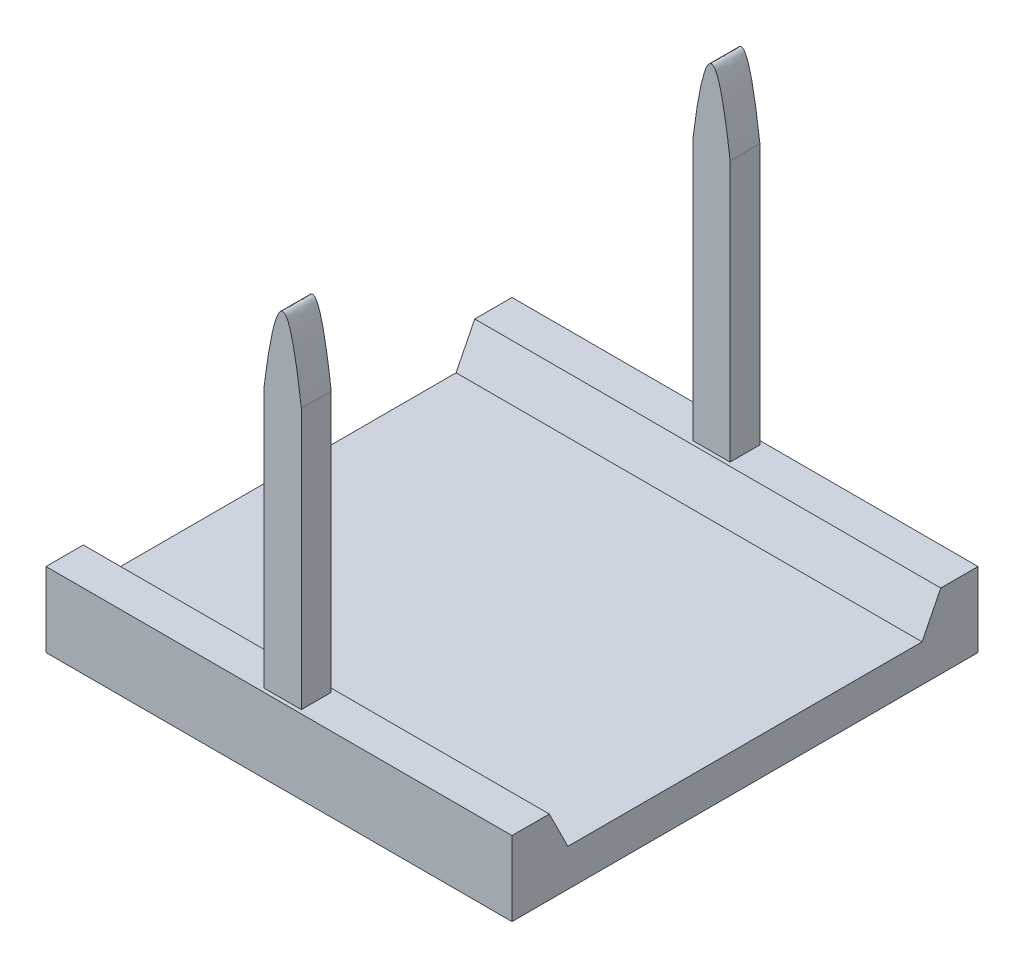
ISO-10303-21;
HEADER;
FILE_DESCRIPTION(('STEP AP214'),'2;1');
FILE_NAME('part.step','',(''),(''),'','','');
FILE_SCHEMA(('AUTOMOTIVE_DESIGN { 1 0 10303 214 1 1 1 1 }'));
ENDSEC;
DATA;
#1=APPLICATION_CONTEXT('core data for automotive mechanical design processes');
#2=APPLICATION_PROTOCOL_DEFINITION('international standard','automotive_design',2000,#1);
#3=PRODUCT_CONTEXT('',#1,'mechanical');
#4=PRODUCT('Part','Part','',(#3));
#5=PRODUCT_RELATED_PRODUCT_CATEGORY('part','',(#4));
#6=PRODUCT_DEFINITION_FORMATION('','',#4);
#7=PRODUCT_DEFINITION_CONTEXT('part definition',#1,'design');
#8=PRODUCT_DEFINITION('design','',#6,#7);
#9=PRODUCT_DEFINITION_SHAPE('','',#8);
#10=(LENGTH_UNIT() NAMED_UNIT(*) SI_UNIT(.MILLI.,.METRE.));
#11=(NAMED_UNIT(*) PLANE_ANGLE_UNIT() SI_UNIT($,.RADIAN.));
#12=(NAMED_UNIT(*) SI_UNIT($,.STERADIAN.) SOLID_ANGLE_UNIT());
#13=UNCERTAINTY_MEASURE_WITH_UNIT(LENGTH_MEASURE(1.E-05),#10,'distance_accuracy_value','');
#14=(GEOMETRIC_REPRESENTATION_CONTEXT(3) GLOBAL_UNCERTAINTY_ASSIGNED_CONTEXT((#13)) GLOBAL_UNIT_ASSIGNED_CONTEXT((#10,
#11,#12)) REPRESENTATION_CONTEXT('',''));
#15=CARTESIAN_POINT('',(0.,0.,0.));
#16=DIRECTION('',(0.,0.,1.));
#17=DIRECTION('',(1.,0.,0.));
#18=AXIS2_PLACEMENT_3D('',#15,#16,#17);
#19=CARTESIAN_POINT('',(0.,20.,-125.));
#20=DIRECTION('',(0.,0.,1.));
#21=DIRECTION('',(1.,0.,0.));
#22=AXIS2_PLACEMENT_3D('',#19,#20,#21);
#23=PLANE('',#22);
#24=DIRECTION('',(0.,-1.,0.));
#25=VECTOR('',#24,1.);
#26=CARTESIAN_POINT('',(0.,20.,-125.));
#27=LINE('',#26,#25);
#28=CARTESIAN_POINT('',(0.,20.,-125.));
#29=VERTEX_POINT('',#28);
#30=CARTESIAN_POINT('',(0.,0.,-125.));
#31=VERTEX_POINT('',#30);
#32=EDGE_CURVE('E307',#29,#31,#27,.T.);
#33=ORIENTED_EDGE('',*,*,#32,.F.);
#34=DIRECTION('',(-1.,0.,0.));
#35=VECTOR('',#34,1.);
#36=CARTESIAN_POINT('',(0.,20.,-125.));
#37=LINE('',#36,#35);
#38=CARTESIAN_POINT('',(125.,20.,-125.));
#39=VERTEX_POINT('',#38);
#40=EDGE_CURVE('E302',#39,#29,#37,.T.);
#41=ORIENTED_EDGE('',*,*,#40,.F.);
#42=DIRECTION('',(0.,-1.,0.));
#43=VECTOR('',#42,1.);
#44=CARTESIAN_POINT('',(125.,20.,-125.));
#45=LINE('',#44,#43);
#46=CARTESIAN_POINT('',(125.,0.,-125.));
#47=VERTEX_POINT('',#46);
#48=EDGE_CURVE('E295',#39,#47,#45,.T.);
#49=ORIENTED_EDGE('',*,*,#48,.T.);
#50=DIRECTION('',(-1.,0.,0.));
#51=VECTOR('',#50,1.);
#52=CARTESIAN_POINT('',(0.,0.,-125.));
#53=LINE('',#52,#51);
#54=EDGE_CURVE('E322',#47,#31,#53,.T.);
#55=ORIENTED_EDGE('',*,*,#54,.T.);
#56=EDGE_LOOP('',(#33,#41,#49,#55));
#57=FACE_BOUND('',#56,.T.);
#58=ADVANCED_FACE('F39',(#57),#23,.F.);
#59=CARTESIAN_POINT('',(0.,20.,0.));
#60=DIRECTION('',(0.,-1.,0.));
#61=DIRECTION('',(0.,0.,-1.));
#62=AXIS2_PLACEMENT_3D('',#59,#60,#61);
#63=PLANE('',#62);
#64=DIRECTION('',(0.,0.,-1.));
#65=VECTOR('',#64,1.);
#66=CARTESIAN_POINT('',(67.5,20.,-115.));
#67=LINE('',#66,#65);
#68=CARTESIAN_POINT('',(67.5000000000001,20.,-116.));
#69=VERTEX_POINT('',#68);
#70=CARTESIAN_POINT('',(67.5,20.,-124.));
#71=VERTEX_POINT('',#70);
#72=EDGE_CURVE('E181',#69,#71,#67,.T.);
#73=ORIENTED_EDGE('',*,*,#72,.F.);
#74=DIRECTION('',(-1.,0.,0.));
#75=VECTOR('',#74,1.);
#76=CARTESIAN_POINT('',(67.5000000000001,20.,-116.));
#77=LINE('',#76,#75);
#78=CARTESIAN_POINT('',(57.5,20.,-116.));
#79=VERTEX_POINT('',#78);
#80=EDGE_CURVE('E160',#69,#79,#77,.T.);
#81=ORIENTED_EDGE('',*,*,#80,.T.);
#82=DIRECTION('',(0.,0.,-1.));
#83=VECTOR('',#82,1.);
#84=CARTESIAN_POINT('',(57.5,20.,-115.));
#85=LINE('',#84,#83);
#86=CARTESIAN_POINT('',(57.5,20.,-124.));
#87=VERTEX_POINT('',#86);
#88=EDGE_CURVE('E55',#79,#87,#85,.T.);
#89=ORIENTED_EDGE('',*,*,#88,.T.);
#90=DIRECTION('',(1.,0.,0.));
#91=VECTOR('',#90,1.);
#92=CARTESIAN_POINT('',(57.5,20.,-124.));
#93=LINE('',#92,#91);
#94=EDGE_CURVE('E389',#87,#71,#93,.T.);
#95=ORIENTED_EDGE('',*,*,#94,.T.);
#96=EDGE_LOOP('',(#73,#81,#89,#95));
#97=FACE_BOUND('',#96,.T.);
#98=DIRECTION('',(0.,0.,1.));
#99=VECTOR('',#98,1.);
#100=CARTESIAN_POINT('',(0.,20.,0.));
#101=LINE('',#100,#99);
#102=CARTESIAN_POINT('',(0.,20.,-115.));
#103=VERTEX_POINT('',#102);
#104=EDGE_CURVE('E370',#29,#103,#101,.T.);
#105=ORIENTED_EDGE('',*,*,#104,.T.);
#106=DIRECTION('',(-1.,0.,0.));
#107=VECTOR('',#106,1.);
#108=CARTESIAN_POINT('',(503.630585933215,20.,-115.));
#109=LINE('',#108,#107);
#110=CARTESIAN_POINT('',(125.,20.,-115.));
#111=VERTEX_POINT('',#110);
#112=EDGE_CURVE('E350',#111,#103,#109,.T.);
#113=ORIENTED_EDGE('',*,*,#112,.F.);
#114=DIRECTION('',(0.,0.,-1.));
#115=VECTOR('',#114,1.);
#116=CARTESIAN_POINT('',(125.,20.,0.));
#117=LINE('',#116,#115);
#118=EDGE_CURVE('E303',#111,#39,#117,.T.);
#119=ORIENTED_EDGE('',*,*,#118,.T.);
#120=ORIENTED_EDGE('',*,*,#40,.T.);
#121=EDGE_LOOP('',(#105,#113,#119,#120));
#122=FACE_BOUND('',#121,.T.);
#123=ADVANCED_FACE('F269',(#97,#122),#63,.F.);
#124=CARTESIAN_POINT('',(0.,20.,0.));
#125=DIRECTION('',(1.,0.,0.));
#126=DIRECTION('',(0.,0.,-1.));
#127=AXIS2_PLACEMENT_3D('',#124,#125,#126);
#128=PLANE('',#127);
#129=DIRECTION('',(0.,0.894427190999916,0.447213595499958));
#130=VECTOR('',#129,1.);
#131=CARTESIAN_POINT('',(0.,24.,-8.));
#132=LINE('',#131,#130);
#133=CARTESIAN_POINT('',(0.,10.,-15.));
#134=VERTEX_POINT('',#133);
#135=CARTESIAN_POINT('',(0.,20.,-10.));
#136=VERTEX_POINT('',#135);
#137=EDGE_CURVE('E316',#134,#136,#132,.T.);
#138=ORIENTED_EDGE('',*,*,#137,.F.);
#139=DIRECTION('',(0.,0.,1.));
#140=VECTOR('',#139,1.);
#141=CARTESIAN_POINT('',(0.,10.,0.));
#142=LINE('',#141,#140);
#143=CARTESIAN_POINT('',(0.,10.,-110.));
#144=VERTEX_POINT('',#143);
#145=EDGE_CURVE('E365',#144,#134,#142,.T.);
#146=ORIENTED_EDGE('',*,*,#145,.F.);
#147=DIRECTION('',(0.,-0.894427190999916,0.447213595499958));
#148=VECTOR('',#147,1.);
#149=CARTESIAN_POINT('',(0.,-26.,-92.));
#150=LINE('',#149,#148);
#151=EDGE_CURVE('E348',#103,#144,#150,.T.);
#152=ORIENTED_EDGE('',*,*,#151,.F.);
#153=ORIENTED_EDGE('',*,*,#104,.F.);
#154=ORIENTED_EDGE('',*,*,#32,.T.);
#155=DIRECTION('',(0.,0.,1.));
#156=VECTOR('',#155,1.);
#157=CARTESIAN_POINT('',(0.,0.,0.));
#158=LINE('',#157,#156);
#159=CARTESIAN_POINT('',(0.,0.,0.));
#160=VERTEX_POINT('',#159);
#161=EDGE_CURVE('E312',#31,#160,#158,.T.);
#162=ORIENTED_EDGE('',*,*,#161,.T.);
#163=DIRECTION('',(0.,-1.,0.));
#164=VECTOR('',#163,1.);
#165=CARTESIAN_POINT('',(0.,20.,0.));
#166=LINE('',#165,#164);
#167=CARTESIAN_POINT('',(0.,20.,0.));
#168=VERTEX_POINT('',#167);
#169=EDGE_CURVE('E294',#168,#160,#166,.T.);
#170=ORIENTED_EDGE('',*,*,#169,.F.);
#171=EDGE_CURVE('E325',#136,#168,#101,.T.);
#172=ORIENTED_EDGE('',*,*,#171,.F.);
#173=EDGE_LOOP('',(#138,#146,#152,#153,#154,#162,#170,#172));
#174=FACE_BOUND('',#173,.T.);
#175=ADVANCED_FACE('F41',(#174),#128,.F.);
#176=CARTESIAN_POINT('',(125.,20.,0.));
#177=DIRECTION('',(-1.,0.,0.));
#178=DIRECTION('',(0.,0.,1.));
#179=AXIS2_PLACEMENT_3D('',#176,#177,#178);
#180=PLANE('',#179);
#181=DIRECTION('',(0.,-0.894427190999916,-0.447213595499958));
#182=VECTOR('',#181,1.);
#183=CARTESIAN_POINT('',(125.,24.,-8.));
#184=LINE('',#183,#182);
#185=CARTESIAN_POINT('',(125.,20.,-10.));
#186=VERTEX_POINT('',#185);
#187=CARTESIAN_POINT('',(125.,10.,-15.));
#188=VERTEX_POINT('',#187);
#189=EDGE_CURVE('E11',#186,#188,#184,.T.);
#190=ORIENTED_EDGE('',*,*,#189,.F.);
#191=CARTESIAN_POINT('',(125.,20.,0.));
#192=VERTEX_POINT('',#191);
#193=EDGE_CURVE('E298',#192,#186,#117,.T.);
#194=ORIENTED_EDGE('',*,*,#193,.F.);
#195=DIRECTION('',(0.,-1.,0.));
#196=VECTOR('',#195,1.);
#197=CARTESIAN_POINT('',(125.,20.,0.));
#198=LINE('',#197,#196);
#199=CARTESIAN_POINT('',(125.,0.,0.));
#200=VERTEX_POINT('',#199);
#201=EDGE_CURVE('E286',#192,#200,#198,.T.);
#202=ORIENTED_EDGE('',*,*,#201,.T.);
#203=DIRECTION('',(0.,0.,-1.));
#204=VECTOR('',#203,1.);
#205=CARTESIAN_POINT('',(125.,0.,0.));
#206=LINE('',#205,#204);
#207=EDGE_CURVE('E319',#200,#47,#206,.T.);
#208=ORIENTED_EDGE('',*,*,#207,.T.);
#209=ORIENTED_EDGE('',*,*,#48,.F.);
#210=ORIENTED_EDGE('',*,*,#118,.F.);
#211=DIRECTION('',(0.,0.894427190999916,-0.447213595499958));
#212=VECTOR('',#211,1.);
#213=CARTESIAN_POINT('',(125.,-26.,-92.));
#214=LINE('',#213,#212);
#215=CARTESIAN_POINT('',(125.,10.,-110.));
#216=VERTEX_POINT('',#215);
#217=EDGE_CURVE('E334',#216,#111,#214,.T.);
#218=ORIENTED_EDGE('',*,*,#217,.F.);
#219=DIRECTION('',(0.,0.,-1.));
#220=VECTOR('',#219,1.);
#221=CARTESIAN_POINT('',(125.,10.,0.));
#222=LINE('',#221,#220);
#223=EDGE_CURVE('E48',#188,#216,#222,.T.);
#224=ORIENTED_EDGE('',*,*,#223,.F.);
#225=EDGE_LOOP('',(#190,#194,#202,#208,#209,#210,#218,#224));
#226=FACE_BOUND('',#225,.T.);
#227=ADVANCED_FACE('F276',(#226),#180,.F.);
#228=CARTESIAN_POINT('',(0.,20.,0.));
#229=DIRECTION('',(0.,0.,-1.));
#230=DIRECTION('',(-1.,0.,0.));
#231=AXIS2_PLACEMENT_3D('',#228,#229,#230);
#232=PLANE('',#231);
#233=ORIENTED_EDGE('',*,*,#201,.F.);
#234=DIRECTION('',(1.,0.,0.));
#235=VECTOR('',#234,1.);
#236=CARTESIAN_POINT('',(0.,20.,0.));
#237=LINE('',#236,#235);
#238=EDGE_CURVE('E289',#168,#192,#237,.T.);
#239=ORIENTED_EDGE('',*,*,#238,.F.);
#240=ORIENTED_EDGE('',*,*,#169,.T.);
#241=DIRECTION('',(1.,0.,0.));
#242=VECTOR('',#241,1.);
#243=CARTESIAN_POINT('',(0.,0.,0.));
#244=LINE('',#243,#242);
#245=EDGE_CURVE('E291',#160,#200,#244,.T.);
#246=ORIENTED_EDGE('',*,*,#245,.T.);
#247=EDGE_LOOP('',(#233,#239,#240,#246));
#248=FACE_BOUND('',#247,.T.);
#249=ADVANCED_FACE('F268',(#248),#232,.F.);
#250=DIRECTION('',(0.,0.,1.));
#251=VECTOR('',#250,1.);
#252=CARTESIAN_POINT('',(57.5,20.,-10.));
#253=LINE('',#252,#251);
#254=CARTESIAN_POINT('',(57.5,20.,-9.));
#255=VERTEX_POINT('',#254);
#256=CARTESIAN_POINT('',(57.5,20.,-1.));
#257=VERTEX_POINT('',#256);
#258=EDGE_CURVE('E234',#255,#257,#253,.T.);
#259=ORIENTED_EDGE('',*,*,#258,.F.);
#260=DIRECTION('',(-1.,0.,0.));
#261=VECTOR('',#260,1.);
#262=CARTESIAN_POINT('',(67.5000000000001,20.,-9.));
#263=LINE('',#262,#261);
#264=CARTESIAN_POINT('',(67.5000000000001,20.,-9.));
#265=VERTEX_POINT('',#264);
#266=EDGE_CURVE('E196',#265,#255,#263,.T.);
#267=ORIENTED_EDGE('',*,*,#266,.F.);
#268=DIRECTION('',(0.,0.,1.));
#269=VECTOR('',#268,1.);
#270=CARTESIAN_POINT('',(67.5,20.,-10.));
#271=LINE('',#270,#269);
#272=CARTESIAN_POINT('',(67.5,20.,-0.999999999999999));
#273=VERTEX_POINT('',#272);
#274=EDGE_CURVE('E63',#265,#273,#271,.T.);
#275=ORIENTED_EDGE('',*,*,#274,.T.);
#276=DIRECTION('',(1.,0.,0.));
#277=VECTOR('',#276,1.);
#278=CARTESIAN_POINT('',(57.5,20.,-1.));
#279=LINE('',#278,#277);
#280=EDGE_CURVE('E227',#257,#273,#279,.T.);
#281=ORIENTED_EDGE('',*,*,#280,.F.);
#282=EDGE_LOOP('',(#259,#267,#275,#281));
#283=FACE_BOUND('',#282,.T.);
#284=DIRECTION('',(-1.,0.,0.));
#285=VECTOR('',#284,1.);
#286=CARTESIAN_POINT('',(503.630585933215,20.,-10.));
#287=LINE('',#286,#285);
#288=EDGE_CURVE('E360',#186,#136,#287,.T.);
#289=ORIENTED_EDGE('',*,*,#288,.T.);
#290=ORIENTED_EDGE('',*,*,#171,.T.);
#291=ORIENTED_EDGE('',*,*,#238,.T.);
#292=ORIENTED_EDGE('',*,*,#193,.T.);
#293=EDGE_LOOP('',(#289,#290,#291,#292));
#294=FACE_BOUND('',#293,.T.);
#295=ADVANCED_FACE('F265',(#283,#294),#63,.F.);
#296=CARTESIAN_POINT('',(0.,0.,0.));
#297=DIRECTION('',(0.,-1.,0.));
#298=DIRECTION('',(0.,0.,-1.));
#299=AXIS2_PLACEMENT_3D('',#296,#297,#298);
#300=PLANE('',#299);
#301=ORIENTED_EDGE('',*,*,#161,.F.);
#302=ORIENTED_EDGE('',*,*,#54,.F.);
#303=ORIENTED_EDGE('',*,*,#207,.F.);
#304=ORIENTED_EDGE('',*,*,#245,.F.);
#305=EDGE_LOOP('',(#301,#302,#303,#304));
#306=FACE_BOUND('',#305,.T.);
#307=ADVANCED_FACE('F263',(#306),#300,.T.);
#308=CARTESIAN_POINT('',(503.630585933215,20.,-10.));
#309=DIRECTION('',(0.,0.447213595499958,-0.894427190999916));
#310=DIRECTION('',(0.,0.894427190999916,0.447213595499958));
#311=AXIS2_PLACEMENT_3D('',#308,#309,#310);
#312=PLANE('',#311);
#313=DIRECTION('',(-1.,0.,0.));
#314=VECTOR('',#313,1.);
#315=CARTESIAN_POINT('',(503.630585933215,10.,-15.));
#316=LINE('',#315,#314);
#317=EDGE_CURVE('E345',#188,#134,#316,.T.);
#318=ORIENTED_EDGE('',*,*,#317,.T.);
#319=ORIENTED_EDGE('',*,*,#137,.T.);
#320=ORIENTED_EDGE('',*,*,#288,.F.);
#321=ORIENTED_EDGE('',*,*,#189,.T.);
#322=EDGE_LOOP('',(#318,#319,#320,#321));
#323=FACE_BOUND('',#322,.T.);
#324=ADVANCED_FACE('F259',(#323),#312,.T.);
#325=CARTESIAN_POINT('',(503.630585933215,10.,-15.));
#326=DIRECTION('',(0.,1.,0.));
#327=DIRECTION('',(0.,0.,1.));
#328=AXIS2_PLACEMENT_3D('',#325,#326,#327);
#329=PLANE('',#328);
#330=DIRECTION('',(-1.,0.,0.));
#331=VECTOR('',#330,1.);
#332=CARTESIAN_POINT('',(503.630585933215,10.,-110.));
#333=LINE('',#332,#331);
#334=EDGE_CURVE('E343',#216,#144,#333,.T.);
#335=ORIENTED_EDGE('',*,*,#334,.T.);
#336=ORIENTED_EDGE('',*,*,#145,.T.);
#337=ORIENTED_EDGE('',*,*,#317,.F.);
#338=ORIENTED_EDGE('',*,*,#223,.T.);
#339=EDGE_LOOP('',(#335,#336,#337,#338));
#340=FACE_BOUND('',#339,.T.);
#341=ADVANCED_FACE('F255',(#340),#329,.T.);
#342=CARTESIAN_POINT('',(503.630585933215,10.,-110.));
#343=DIRECTION('',(0.,0.447213595499958,0.894427190999916));
#344=DIRECTION('',(0.,-0.894427190999916,0.447213595499958));
#345=AXIS2_PLACEMENT_3D('',#342,#343,#344);
#346=PLANE('',#345);
#347=ORIENTED_EDGE('',*,*,#112,.T.);
#348=ORIENTED_EDGE('',*,*,#151,.T.);
#349=ORIENTED_EDGE('',*,*,#334,.F.);
#350=ORIENTED_EDGE('',*,*,#217,.T.);
#351=EDGE_LOOP('',(#347,#348,#349,#350));
#352=FACE_BOUND('',#351,.T.);
#353=ADVANCED_FACE('F252',(#352),#346,.T.);
#354=CARTESIAN_POINT('',(57.5,20.,-10.));
#355=DIRECTION('',(-1.,0.,0.));
#356=DIRECTION('',(0.,0.,1.));
#357=AXIS2_PLACEMENT_3D('',#354,#355,#356);
#358=PLANE('',#357);
#359=DIRECTION('',(0.,1.,0.));
#360=VECTOR('',#359,1.);
#361=CARTESIAN_POINT('',(57.5,20.,-9.));
#362=LINE('',#361,#360);
#363=CARTESIAN_POINT('',(57.5,90.,-9.));
#364=VERTEX_POINT('',#363);
#365=EDGE_CURVE('E199',#255,#364,#362,.T.);
#366=ORIENTED_EDGE('',*,*,#365,.F.);
#367=ORIENTED_EDGE('',*,*,#258,.T.);
#368=DIRECTION('',(-2.60188695930948E-11,-1.,0.));
#369=VECTOR('',#368,1.);
#370=CARTESIAN_POINT('',(57.5000000018213,90.0000000146406,-1.));
#371=LINE('',#370,#369);
#372=CARTESIAN_POINT('',(57.5000000018213,90.0000000146406,-1.));
#373=VERTEX_POINT('',#372);
#374=EDGE_CURVE('E220',#373,#257,#371,.T.);
#375=ORIENTED_EDGE('',*,*,#374,.F.);
#376=DIRECTION('',(0.,0.,1.));
#377=VECTOR('',#376,1.);
#378=CARTESIAN_POINT('',(57.5,90.,-10.));
#379=LINE('',#378,#377);
#380=EDGE_CURVE('E355',#364,#373,#379,.T.);
#381=ORIENTED_EDGE('',*,*,#380,.F.);
#382=EDGE_LOOP('',(#366,#367,#375,#381));
#383=FACE_BOUND('',#382,.T.);
#384=ADVANCED_FACE('F245',(#383),#358,.T.);
#385=CARTESIAN_POINT('',(67.5,90.,-10.));
#386=CARTESIAN_POINT('',(62.5,130.,-10.));
#387=CARTESIAN_POINT('',(57.5,90.,-10.));
#388=B_SPLINE_CURVE_WITH_KNOTS('',2,(#385,#386,#387),.UNSPECIFIED.,.F.,.F.,(3,3),(0.,1.),.UNSPECIFIED.);
#389=DIRECTION('',(0.,0.,1.));
#390=VECTOR('',#389,1.);
#391=SURFACE_OF_LINEAR_EXTRUSION('',#388,#390);
#392=CARTESIAN_POINT('',(-1055.53398874891,-999890.,-9.));
#393=CARTESIAN_POINT('',(62.5000000000044,1000110.,-9.));
#394=CARTESIAN_POINT('',(1180.53398874892,-999890.,-9.));
#395=B_SPLINE_CURVE_WITH_KNOTS('',2,(#392,#393,#394),.UNSPECIFIED.,.F.,.F.,(3,3),(0.,1.),.UNSPECIFIED.);
#396=CARTESIAN_POINT('',(67.4999999963452,90.0000000292813,-9.));
#397=VERTEX_POINT('',#396);
#398=EDGE_CURVE('E202',#364,#397,#395,.T.);
#399=ORIENTED_EDGE('',*,*,#398,.F.);
#400=ORIENTED_EDGE('',*,*,#380,.T.);
#401=CARTESIAN_POINT('',(1180.53398874891,-999890.,-1.));
#402=CARTESIAN_POINT('',(62.4999999999956,1000110.,-1.));
#403=CARTESIAN_POINT('',(-1055.53398874892,-999890.,-1.));
#404=B_SPLINE_CURVE_WITH_KNOTS('',2,(#401,#402,#403),.UNSPECIFIED.,.F.,.F.,(3,3),(0.,1.),.UNSPECIFIED.);
#405=CARTESIAN_POINT('',(67.5000000045416,89.9999999636378,-1.));
#406=VERTEX_POINT('',#405);
#407=EDGE_CURVE('E214',#406,#373,#404,.T.);
#408=ORIENTED_EDGE('',*,*,#407,.F.);
#409=DIRECTION('',(0.,0.,1.));
#410=VECTOR('',#409,1.);
#411=CARTESIAN_POINT('',(67.5,90.,-10.));
#412=LINE('',#411,#410);
#413=EDGE_CURVE('E438',#397,#406,#412,.T.);
#414=ORIENTED_EDGE('',*,*,#413,.F.);
#415=EDGE_LOOP('',(#399,#400,#408,#414));
#416=FACE_BOUND('',#415,.T.);
#417=ADVANCED_FACE('F240',(#416),#391,.T.);
#418=CARTESIAN_POINT('',(67.5,20.,-10.));
#419=DIRECTION('',(1.,0.,0.));
#420=DIRECTION('',(0.,0.,-1.));
#421=AXIS2_PLACEMENT_3D('',#418,#419,#420);
#422=PLANE('',#421);
#423=DIRECTION('',(2.60196626095408E-11,-1.,0.));
#424=VECTOR('',#423,1.);
#425=CARTESIAN_POINT('',(67.4999999981787,90.0000000146406,-9.));
#426=LINE('',#425,#424);
#427=EDGE_CURVE('E185',#397,#265,#426,.T.);
#428=ORIENTED_EDGE('',*,*,#427,.F.);
#429=ORIENTED_EDGE('',*,*,#413,.T.);
#430=DIRECTION('',(0.,1.,0.));
#431=VECTOR('',#430,1.);
#432=CARTESIAN_POINT('',(67.5,20.,-1.));
#433=LINE('',#432,#431);
#434=EDGE_CURVE('E207',#273,#406,#433,.T.);
#435=ORIENTED_EDGE('',*,*,#434,.F.);
#436=ORIENTED_EDGE('',*,*,#274,.F.);
#437=EDGE_LOOP('',(#428,#429,#435,#436));
#438=FACE_BOUND('',#437,.T.);
#439=ADVANCED_FACE('F244',(#438),#422,.T.);
#440=CARTESIAN_POINT('',(62.4999999999956,110.000000000042,-1.));
#441=DIRECTION('',(0.,0.,-1.));
#442=DIRECTION('',(-1.,0.,0.));
#443=AXIS2_PLACEMENT_3D('',#440,#441,#442);
#444=PLANE('',#443);
#445=ORIENTED_EDGE('',*,*,#434,.T.);
#446=ORIENTED_EDGE('',*,*,#407,.T.);
#447=ORIENTED_EDGE('',*,*,#374,.T.);
#448=ORIENTED_EDGE('',*,*,#280,.T.);
#449=EDGE_LOOP('',(#445,#446,#447,#448));
#450=FACE_BOUND('',#449,.T.);
#451=ADVANCED_FACE('F250',(#450),#444,.F.);
#452=CARTESIAN_POINT('',(62.5000000000044,110.000000000042,-9.));
#453=DIRECTION('',(0.,0.,1.));
#454=DIRECTION('',(1.,0.,0.));
#455=AXIS2_PLACEMENT_3D('',#452,#453,#454);
#456=PLANE('',#455);
#457=ORIENTED_EDGE('',*,*,#427,.T.);
#458=ORIENTED_EDGE('',*,*,#266,.T.);
#459=ORIENTED_EDGE('',*,*,#365,.T.);
#460=ORIENTED_EDGE('',*,*,#398,.T.);
#461=EDGE_LOOP('',(#457,#458,#459,#460));
#462=FACE_BOUND('',#461,.T.);
#463=ADVANCED_FACE('F426',(#462),#456,.F.);
#464=CARTESIAN_POINT('',(67.5,20.,-115.));
#465=DIRECTION('',(-1.,0.,0.));
#466=DIRECTION('',(0.,0.,1.));
#467=AXIS2_PLACEMENT_3D('',#464,#465,#466);
#468=PLANE('',#467);
#469=DIRECTION('',(0.,0.,-1.));
#470=VECTOR('',#469,1.);
#471=CARTESIAN_POINT('',(67.5,90.,-115.));
#472=LINE('',#471,#470);
#473=CARTESIAN_POINT('',(67.4999999963452,90.0000000292813,-116.));
#474=VERTEX_POINT('',#473);
#475=CARTESIAN_POINT('',(67.5000000045416,89.9999999636378,-124.));
#476=VERTEX_POINT('',#475);
#477=EDGE_CURVE('E170',#474,#476,#472,.T.);
#478=ORIENTED_EDGE('',*,*,#477,.F.);
#479=DIRECTION('',(2.60196626095408E-11,-1.,0.));
#480=VECTOR('',#479,1.);
#481=CARTESIAN_POINT('',(67.4999999981787,90.0000000146406,-116.));
#482=LINE('',#481,#480);
#483=EDGE_CURVE('E154',#474,#69,#482,.T.);
#484=ORIENTED_EDGE('',*,*,#483,.T.);
#485=ORIENTED_EDGE('',*,*,#72,.T.);
#486=DIRECTION('',(0.,1.,0.));
#487=VECTOR('',#486,1.);
#488=CARTESIAN_POINT('',(67.5,20.,-124.));
#489=LINE('',#488,#487);
#490=EDGE_CURVE('E179',#71,#476,#489,.T.);
#491=ORIENTED_EDGE('',*,*,#490,.T.);
#492=EDGE_LOOP('',(#478,#484,#485,#491));
#493=FACE_BOUND('',#492,.T.);
#494=ADVANCED_FACE('F177',(#493),#468,.F.);
#495=CARTESIAN_POINT('',(67.5,90.,-115.));
#496=CARTESIAN_POINT('',(62.5,130.,-115.));
#497=CARTESIAN_POINT('',(57.5,90.,-115.));
#498=B_SPLINE_CURVE_WITH_KNOTS('',2,(#495,#496,#497),.UNSPECIFIED.,.F.,.F.,(3,3),(0.,1.),.UNSPECIFIED.);
#499=DIRECTION('',(0.,0.,-1.));
#500=VECTOR('',#499,1.);
#501=SURFACE_OF_LINEAR_EXTRUSION('',#498,#500);
#502=DIRECTION('',(0.,0.,-1.));
#503=VECTOR('',#502,1.);
#504=CARTESIAN_POINT('',(57.5,90.,-115.));
#505=LINE('',#504,#503);
#506=CARTESIAN_POINT('',(57.5,90.,-116.));
#507=VERTEX_POINT('',#506);
#508=CARTESIAN_POINT('',(57.5000000018213,90.0000000146406,-124.));
#509=VERTEX_POINT('',#508);
#510=EDGE_CURVE('E172',#507,#509,#505,.T.);
#511=ORIENTED_EDGE('',*,*,#510,.F.);
#512=CARTESIAN_POINT('',(-1055.53398874891,-999890.,-116.));
#513=CARTESIAN_POINT('',(62.5000000000044,1000110.,-116.));
#514=CARTESIAN_POINT('',(1180.53398874892,-999890.,-116.));
#515=B_SPLINE_CURVE_WITH_KNOTS('',2,(#512,#513,#514),.UNSPECIFIED.,.F.,.F.,(3,3),(0.,1.),.UNSPECIFIED.);
#516=EDGE_CURVE('E158',#507,#474,#515,.T.);
#517=ORIENTED_EDGE('',*,*,#516,.T.);
#518=ORIENTED_EDGE('',*,*,#477,.T.);
#519=CARTESIAN_POINT('',(1180.53398874891,-999890.,-124.));
#520=CARTESIAN_POINT('',(62.4999999999956,1000110.,-124.));
#521=CARTESIAN_POINT('',(-1055.53398874892,-999890.,-124.));
#522=B_SPLINE_CURVE_WITH_KNOTS('',2,(#519,#520,#521),.UNSPECIFIED.,.F.,.F.,(3,3),(0.,1.),.UNSPECIFIED.);
#523=EDGE_CURVE('E192',#476,#509,#522,.T.);
#524=ORIENTED_EDGE('',*,*,#523,.T.);
#525=EDGE_LOOP('',(#511,#517,#518,#524));
#526=FACE_BOUND('',#525,.T.);
#527=ADVANCED_FACE('F168',(#526),#501,.F.);
#528=CARTESIAN_POINT('',(57.5,20.,-115.));
#529=DIRECTION('',(1.,0.,0.));
#530=DIRECTION('',(0.,0.,-1.));
#531=AXIS2_PLACEMENT_3D('',#528,#529,#530);
#532=PLANE('',#531);
#533=ORIENTED_EDGE('',*,*,#88,.F.);
#534=DIRECTION('',(0.,1.,0.));
#535=VECTOR('',#534,1.);
#536=CARTESIAN_POINT('',(57.5,20.,-116.));
#537=LINE('',#536,#535);
#538=EDGE_CURVE('E174',#79,#507,#537,.T.);
#539=ORIENTED_EDGE('',*,*,#538,.T.);
#540=ORIENTED_EDGE('',*,*,#510,.T.);
#541=DIRECTION('',(-2.60188695930948E-11,-1.,0.));
#542=VECTOR('',#541,1.);
#543=CARTESIAN_POINT('',(57.5000000018213,90.0000000146406,-124.));
#544=LINE('',#543,#542);
#545=EDGE_CURVE('E394',#509,#87,#544,.T.);
#546=ORIENTED_EDGE('',*,*,#545,.T.);
#547=EDGE_LOOP('',(#533,#539,#540,#546));
#548=FACE_BOUND('',#547,.T.);
#549=ADVANCED_FACE('F421',(#548),#532,.F.);
#550=CARTESIAN_POINT('',(62.4999999999956,110.000000000042,-124.));
#551=DIRECTION('',(0.,0.,1.));
#552=DIRECTION('',(-1.,0.,0.));
#553=AXIS2_PLACEMENT_3D('',#550,#551,#552);
#554=PLANE('',#553);
#555=ORIENTED_EDGE('',*,*,#490,.F.);
#556=ORIENTED_EDGE('',*,*,#94,.F.);
#557=ORIENTED_EDGE('',*,*,#545,.F.);
#558=ORIENTED_EDGE('',*,*,#523,.F.);
#559=EDGE_LOOP('',(#555,#556,#557,#558));
#560=FACE_BOUND('',#559,.T.);
#561=ADVANCED_FACE('F396',(#560),#554,.F.);
#562=CARTESIAN_POINT('',(62.5000000000044,110.000000000042,-116.));
#563=DIRECTION('',(0.,0.,-1.));
#564=DIRECTION('',(1.,0.,0.));
#565=AXIS2_PLACEMENT_3D('',#562,#563,#564);
#566=PLANE('',#565);
#567=ORIENTED_EDGE('',*,*,#483,.F.);
#568=ORIENTED_EDGE('',*,*,#516,.F.);
#569=ORIENTED_EDGE('',*,*,#538,.F.);
#570=ORIENTED_EDGE('',*,*,#80,.F.);
#571=EDGE_LOOP('',(#567,#568,#569,#570));
#572=FACE_BOUND('',#571,.T.);
#573=ADVANCED_FACE('F156',(#572),#566,.F.);
#574=CLOSED_SHELL('',(#58,#123,#175,#227,#249,#295,#307,#324,#341,#353,#384,#417,#439,#451,#463,
#494,#527,#549,#561,#573));
#575=MANIFOLD_SOLID_BREP('B2',#574);
#576=ADVANCED_BREP_SHAPE_REPRESENTATION('',(#18,#575),#14);
#577=SHAPE_DEFINITION_REPRESENTATION(#9,#576);
ENDSEC;
END-ISO-10303-21;
